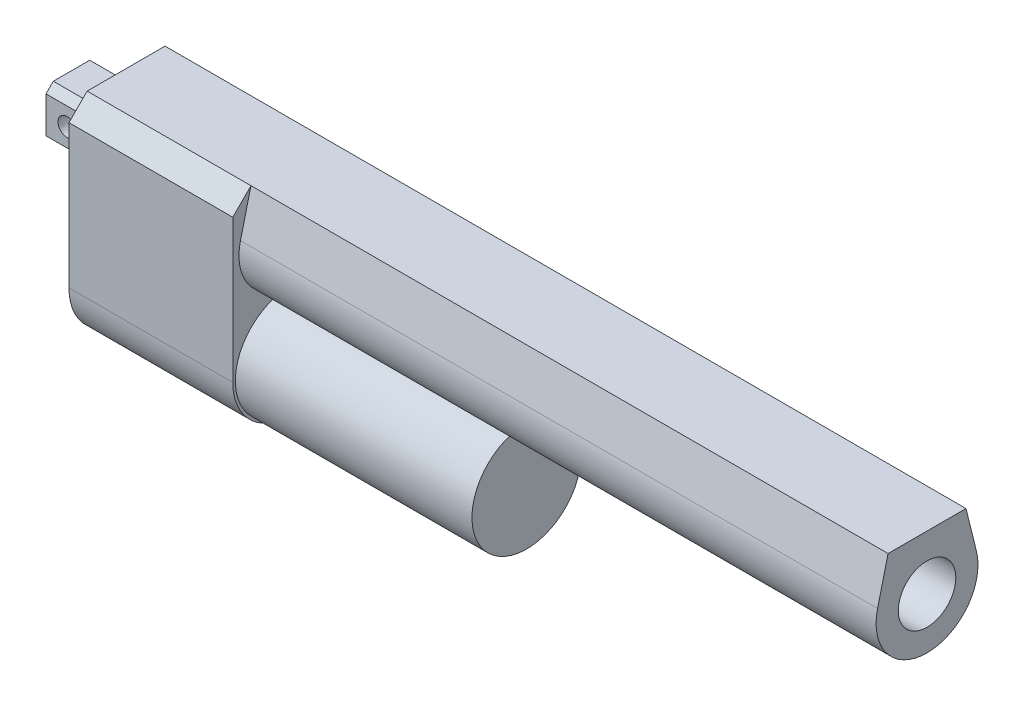
ISO-10303-21;
HEADER;
FILE_DESCRIPTION(('STEP AP214'),'2;1');
FILE_NAME('part.step','',(''),(''),'','','');
FILE_SCHEMA(('AUTOMOTIVE_DESIGN { 1 0 10303 214 1 1 1 1 }'));
ENDSEC;
DATA;
#1=APPLICATION_CONTEXT('core data for automotive mechanical design processes');
#2=APPLICATION_PROTOCOL_DEFINITION('international standard','automotive_design',2000,#1);
#3=PRODUCT_CONTEXT('',#1,'mechanical');
#4=PRODUCT('Part','Part','',(#3));
#5=PRODUCT_RELATED_PRODUCT_CATEGORY('part','',(#4));
#6=PRODUCT_DEFINITION_FORMATION('','',#4);
#7=PRODUCT_DEFINITION_CONTEXT('part definition',#1,'design');
#8=PRODUCT_DEFINITION('design','',#6,#7);
#9=PRODUCT_DEFINITION_SHAPE('','',#8);
#10=(LENGTH_UNIT() NAMED_UNIT(*) SI_UNIT(.MILLI.,.METRE.));
#11=(NAMED_UNIT(*) PLANE_ANGLE_UNIT() SI_UNIT($,.RADIAN.));
#12=(NAMED_UNIT(*) SI_UNIT($,.STERADIAN.) SOLID_ANGLE_UNIT());
#13=UNCERTAINTY_MEASURE_WITH_UNIT(LENGTH_MEASURE(1.E-05),#10,'distance_accuracy_value','');
#14=(GEOMETRIC_REPRESENTATION_CONTEXT(3) GLOBAL_UNCERTAINTY_ASSIGNED_CONTEXT((#13)) GLOBAL_UNIT_ASSIGNED_CONTEXT((#10,
#11,#12)) REPRESENTATION_CONTEXT('',''));
#15=CARTESIAN_POINT('',(0.,0.,0.));
#16=DIRECTION('',(0.,0.,1.));
#17=DIRECTION('',(1.,0.,0.));
#18=AXIS2_PLACEMENT_3D('',#15,#16,#17);
#19=CARTESIAN_POINT('',(57.15,-37.211,0.));
#20=DIRECTION('',(1.,0.,0.));
#21=DIRECTION('',(0.,0.,-1.));
#22=AXIS2_PLACEMENT_3D('',#19,#20,#21);
#23=PLANE('',#22);
#24=CARTESIAN_POINT('',(57.15,-37.211,0.));
#25=DIRECTION('',(1.,0.,0.));
#26=DIRECTION('',(0.,0.,-1.));
#27=AXIS2_PLACEMENT_3D('',#24,#25,#26);
#28=CIRCLE('',#27,19.05);
#29=CARTESIAN_POINT('',(57.15,-37.211,-19.05));
#30=VERTEX_POINT('',#29);
#31=EDGE_CURVE('E248',#30,#30,#28,.T.);
#32=ORIENTED_EDGE('',*,*,#31,.F.);
#33=EDGE_LOOP('',(#32));
#34=FACE_BOUND('',#33,.T.);
#35=CARTESIAN_POINT('',(57.15,0.,0.));
#36=DIRECTION('',(1.,0.,0.));
#37=DIRECTION('',(0.,0.,-1.));
#38=AXIS2_PLACEMENT_3D('',#35,#36,#37);
#39=CIRCLE('',#38,17.78);
#40=CARTESIAN_POINT('',(57.15,4.28552921544395,17.2558001652655));
#41=VERTEX_POINT('',#40);
#42=CARTESIAN_POINT('',(57.15,4.28552921544394,-17.2558001652655));
#43=VERTEX_POINT('',#42);
#44=EDGE_CURVE('E47',#41,#43,#39,.T.);
#45=ORIENTED_EDGE('',*,*,#44,.F.);
#46=DIRECTION('',(0.,-0.970517444615607,0.241030889507533));
#47=VECTOR('',#46,1.);
#48=CARTESIAN_POINT('',(57.15,19.05,13.589));
#49=LINE('',#48,#47);
#50=CARTESIAN_POINT('',(57.15,19.05,13.589));
#51=VERTEX_POINT('',#50);
#52=EDGE_CURVE('E171',#51,#41,#49,.T.);
#53=ORIENTED_EDGE('',*,*,#52,.F.);
#54=DIRECTION('',(0.,-0.707106781186547,0.707106781186547));
#55=VECTOR('',#54,1.);
#56=CARTESIAN_POINT('',(57.15,12.7,19.939));
#57=LINE('',#56,#55);
#58=CARTESIAN_POINT('',(57.15,12.7,19.939));
#59=VERTEX_POINT('',#58);
#60=EDGE_CURVE('E255',#51,#59,#57,.T.);
#61=ORIENTED_EDGE('',*,*,#60,.T.);
#62=DIRECTION('',(0.,-1.,0.));
#63=VECTOR('',#62,1.);
#64=CARTESIAN_POINT('',(57.15,-37.211,19.939));
#65=LINE('',#64,#63);
#66=CARTESIAN_POINT('',(57.15,-37.211,19.939));
#67=VERTEX_POINT('',#66);
#68=EDGE_CURVE('E258',#59,#67,#65,.T.);
#69=ORIENTED_EDGE('',*,*,#68,.T.);
#70=CARTESIAN_POINT('',(57.15,-37.211,0.));
#71=DIRECTION('',(1.,0.,0.));
#72=DIRECTION('',(0.,0.,-1.));
#73=AXIS2_PLACEMENT_3D('',#70,#71,#72);
#74=CIRCLE('',#73,19.939);
#75=CARTESIAN_POINT('',(57.15,-37.211,-19.939));
#76=VERTEX_POINT('',#75);
#77=EDGE_CURVE('E261',#67,#76,#74,.T.);
#78=ORIENTED_EDGE('',*,*,#77,.T.);
#79=DIRECTION('',(0.,1.,0.));
#80=VECTOR('',#79,1.);
#81=CARTESIAN_POINT('',(57.15,-37.211,-19.939));
#82=LINE('',#81,#80);
#83=CARTESIAN_POINT('',(57.15,12.7,-19.939));
#84=VERTEX_POINT('',#83);
#85=EDGE_CURVE('E263',#76,#84,#82,.T.);
#86=ORIENTED_EDGE('',*,*,#85,.T.);
#87=DIRECTION('',(0.,0.707106781186548,0.707106781186547));
#88=VECTOR('',#87,1.);
#89=CARTESIAN_POINT('',(57.15,12.7,-19.939));
#90=LINE('',#89,#88);
#91=CARTESIAN_POINT('',(57.15,19.05,-13.589));
#92=VERTEX_POINT('',#91);
#93=EDGE_CURVE('E265',#84,#92,#90,.T.);
#94=ORIENTED_EDGE('',*,*,#93,.T.);
#95=DIRECTION('',(0.,0.970517444615607,0.241030889507533));
#96=VECTOR('',#95,1.);
#97=CARTESIAN_POINT('',(57.15,19.05,-13.589));
#98=LINE('',#97,#96);
#99=EDGE_CURVE('E52',#43,#92,#98,.T.);
#100=ORIENTED_EDGE('',*,*,#99,.F.);
#101=EDGE_LOOP('',(#45,#53,#61,#69,#78,#86,#94,#100));
#102=FACE_BOUND('',#101,.T.);
#103=ADVANCED_FACE('F32',(#34,#102),#23,.T.);
#104=CARTESIAN_POINT('',(0.,-37.211,0.));
#105=DIRECTION('',(1.,0.,0.));
#106=DIRECTION('',(0.,0.,-1.));
#107=AXIS2_PLACEMENT_3D('',#104,#105,#106);
#108=PLANE('',#107);
#109=DIRECTION('',(0.,-0.707106781186547,0.707106781186547));
#110=VECTOR('',#109,1.);
#111=CARTESIAN_POINT('',(0.,12.7,19.939));
#112=LINE('',#111,#110);
#113=CARTESIAN_POINT('',(0.,19.05,13.589));
#114=VERTEX_POINT('',#113);
#115=CARTESIAN_POINT('',(0.,12.7,19.939));
#116=VERTEX_POINT('',#115);
#117=EDGE_CURVE('E252',#114,#116,#112,.T.);
#118=ORIENTED_EDGE('',*,*,#117,.F.);
#119=DIRECTION('',(0.,0.,1.));
#120=VECTOR('',#119,1.);
#121=CARTESIAN_POINT('',(0.,19.05,13.589));
#122=LINE('',#121,#120);
#123=CARTESIAN_POINT('',(0.,19.05,-13.589));
#124=VERTEX_POINT('',#123);
#125=EDGE_CURVE('E259',#124,#114,#122,.T.);
#126=ORIENTED_EDGE('',*,*,#125,.F.);
#127=DIRECTION('',(0.,0.707106781186548,0.707106781186547));
#128=VECTOR('',#127,1.);
#129=CARTESIAN_POINT('',(0.,12.7,-19.939));
#130=LINE('',#129,#128);
#131=CARTESIAN_POINT('',(0.,12.7,-19.939));
#132=VERTEX_POINT('',#131);
#133=EDGE_CURVE('E276',#132,#124,#130,.T.);
#134=ORIENTED_EDGE('',*,*,#133,.F.);
#135=DIRECTION('',(0.,1.,0.));
#136=VECTOR('',#135,1.);
#137=CARTESIAN_POINT('',(0.,-37.211,-19.939));
#138=LINE('',#137,#136);
#139=CARTESIAN_POINT('',(0.,-37.211,-19.939));
#140=VERTEX_POINT('',#139);
#141=EDGE_CURVE('E274',#140,#132,#138,.T.);
#142=ORIENTED_EDGE('',*,*,#141,.F.);
#143=CARTESIAN_POINT('',(0.,-37.211,0.));
#144=DIRECTION('',(1.,0.,0.));
#145=DIRECTION('',(0.,0.,-1.));
#146=AXIS2_PLACEMENT_3D('',#143,#144,#145);
#147=CIRCLE('',#146,19.939);
#148=CARTESIAN_POINT('',(0.,-37.211,19.939));
#149=VERTEX_POINT('',#148);
#150=EDGE_CURVE('E272',#149,#140,#147,.T.);
#151=ORIENTED_EDGE('',*,*,#150,.F.);
#152=DIRECTION('',(0.,-1.,0.));
#153=VECTOR('',#152,1.);
#154=CARTESIAN_POINT('',(0.,-37.211,19.939));
#155=LINE('',#154,#153);
#156=EDGE_CURVE('E270',#116,#149,#155,.T.);
#157=ORIENTED_EDGE('',*,*,#156,.F.);
#158=EDGE_LOOP('',(#118,#126,#134,#142,#151,#157));
#159=FACE_BOUND('',#158,.T.);
#160=DIRECTION('',(0.,-0.707106781186547,-0.707106781186548));
#161=VECTOR('',#160,1.);
#162=CARTESIAN_POINT('',(0.,6.35,-8.89));
#163=LINE('',#162,#161);
#164=CARTESIAN_POINT('',(0.,8.89,-6.35));
#165=VERTEX_POINT('',#164);
#166=CARTESIAN_POINT('',(0.,6.34999999999999,-8.89));
#167=VERTEX_POINT('',#166);
#168=EDGE_CURVE('E183',#165,#167,#163,.T.);
#169=ORIENTED_EDGE('',*,*,#168,.F.);
#170=DIRECTION('',(0.,0.,-1.));
#171=VECTOR('',#170,1.);
#172=CARTESIAN_POINT('',(0.,8.89,-6.35));
#173=LINE('',#172,#171);
#174=CARTESIAN_POINT('',(0.,8.89,6.35));
#175=VERTEX_POINT('',#174);
#176=EDGE_CURVE('E188',#175,#165,#173,.T.);
#177=ORIENTED_EDGE('',*,*,#176,.F.);
#178=DIRECTION('',(0.,0.707106781186548,-0.707106781186547));
#179=VECTOR('',#178,1.);
#180=CARTESIAN_POINT('',(0.,8.89,6.35));
#181=LINE('',#180,#179);
#182=CARTESIAN_POINT('',(0.,6.35,8.89));
#183=VERTEX_POINT('',#182);
#184=EDGE_CURVE('E220',#183,#175,#181,.T.);
#185=ORIENTED_EDGE('',*,*,#184,.F.);
#186=DIRECTION('',(0.,1.,0.));
#187=VECTOR('',#186,1.);
#188=CARTESIAN_POINT('',(0.,6.35,8.89));
#189=LINE('',#188,#187);
#190=CARTESIAN_POINT('',(0.,-6.34999999999999,8.89));
#191=VERTEX_POINT('',#190);
#192=EDGE_CURVE('E217',#191,#183,#189,.T.);
#193=ORIENTED_EDGE('',*,*,#192,.F.);
#194=DIRECTION('',(0.,0.707106781186548,0.707106781186548));
#195=VECTOR('',#194,1.);
#196=CARTESIAN_POINT('',(0.,-6.35,8.89));
#197=LINE('',#196,#195);
#198=CARTESIAN_POINT('',(0.,-8.89,6.34999999999999));
#199=VERTEX_POINT('',#198);
#200=EDGE_CURVE('E214',#199,#191,#197,.T.);
#201=ORIENTED_EDGE('',*,*,#200,.F.);
#202=DIRECTION('',(0.,0.,1.));
#203=VECTOR('',#202,1.);
#204=CARTESIAN_POINT('',(0.,-8.89,6.35));
#205=LINE('',#204,#203);
#206=CARTESIAN_POINT('',(0.,-8.89,-6.35));
#207=VERTEX_POINT('',#206);
#208=EDGE_CURVE('E211',#207,#199,#205,.T.);
#209=ORIENTED_EDGE('',*,*,#208,.F.);
#210=DIRECTION('',(0.,-0.707106781186547,0.707106781186548));
#211=VECTOR('',#210,1.);
#212=CARTESIAN_POINT('',(0.,-8.89,-6.35));
#213=LINE('',#212,#211);
#214=CARTESIAN_POINT('',(0.,-6.35,-8.89));
#215=VERTEX_POINT('',#214);
#216=EDGE_CURVE('E208',#215,#207,#213,.T.);
#217=ORIENTED_EDGE('',*,*,#216,.F.);
#218=DIRECTION('',(0.,-1.,0.));
#219=VECTOR('',#218,1.);
#220=CARTESIAN_POINT('',(0.,-6.35,-8.89));
#221=LINE('',#220,#219);
#222=EDGE_CURVE('E205',#167,#215,#221,.T.);
#223=ORIENTED_EDGE('',*,*,#222,.F.);
#224=EDGE_LOOP('',(#169,#177,#185,#193,#201,#209,#217,#223));
#225=FACE_BOUND('',#224,.T.);
#226=ADVANCED_FACE('F300',(#159,#225),#108,.F.);
#227=CARTESIAN_POINT('',(57.15,12.7,19.939));
#228=DIRECTION('',(0.,-0.707106781186548,-0.707106781186548));
#229=DIRECTION('',(0.,0.707106781186548,-0.707106781186548));
#230=AXIS2_PLACEMENT_3D('',#227,#228,#229);
#231=PLANE('',#230);
#232=ORIENTED_EDGE('',*,*,#117,.T.);
#233=DIRECTION('',(-1.,0.,0.));
#234=VECTOR('',#233,1.);
#235=CARTESIAN_POINT('',(57.15,12.7,19.939));
#236=LINE('',#235,#234);
#237=EDGE_CURVE('E11',#59,#116,#236,.T.);
#238=ORIENTED_EDGE('',*,*,#237,.F.);
#239=ORIENTED_EDGE('',*,*,#60,.F.);
#240=DIRECTION('',(-1.,0.,0.));
#241=VECTOR('',#240,1.);
#242=CARTESIAN_POINT('',(57.15,19.05,13.589));
#243=LINE('',#242,#241);
#244=EDGE_CURVE('E267',#51,#114,#243,.T.);
#245=ORIENTED_EDGE('',*,*,#244,.T.);
#246=EDGE_LOOP('',(#232,#238,#239,#245));
#247=FACE_BOUND('',#246,.T.);
#248=ADVANCED_FACE('F34',(#247),#231,.F.);
#249=CARTESIAN_POINT('',(57.15,-37.211,19.939));
#250=DIRECTION('',(0.,0.,-1.));
#251=DIRECTION('',(-1.,0.,0.));
#252=AXIS2_PLACEMENT_3D('',#249,#250,#251);
#253=PLANE('',#252);
#254=ORIENTED_EDGE('',*,*,#156,.T.);
#255=DIRECTION('',(-1.,0.,0.));
#256=VECTOR('',#255,1.);
#257=CARTESIAN_POINT('',(57.15,-37.211,19.939));
#258=LINE('',#257,#256);
#259=EDGE_CURVE('E40',#67,#149,#258,.T.);
#260=ORIENTED_EDGE('',*,*,#259,.F.);
#261=ORIENTED_EDGE('',*,*,#68,.F.);
#262=ORIENTED_EDGE('',*,*,#237,.T.);
#263=EDGE_LOOP('',(#254,#260,#261,#262));
#264=FACE_BOUND('',#263,.T.);
#265=ADVANCED_FACE('F313',(#264),#253,.F.);
#266=CARTESIAN_POINT('',(57.15,-37.211,0.));
#267=DIRECTION('',(-1.,0.,0.));
#268=DIRECTION('',(0.,0.,1.));
#269=AXIS2_PLACEMENT_3D('',#266,#267,#268);
#270=CYLINDRICAL_SURFACE('',#269,19.939);
#271=ORIENTED_EDGE('',*,*,#150,.T.);
#272=DIRECTION('',(-1.,0.,0.));
#273=VECTOR('',#272,1.);
#274=CARTESIAN_POINT('',(57.15,-37.211,-19.939));
#275=LINE('',#274,#273);
#276=EDGE_CURVE('E287',#76,#140,#275,.T.);
#277=ORIENTED_EDGE('',*,*,#276,.F.);
#278=ORIENTED_EDGE('',*,*,#77,.F.);
#279=ORIENTED_EDGE('',*,*,#259,.T.);
#280=EDGE_LOOP('',(#271,#277,#278,#279));
#281=FACE_BOUND('',#280,.T.);
#282=ADVANCED_FACE('F294',(#281),#270,.T.);
#283=CARTESIAN_POINT('',(57.15,-37.211,-19.939));
#284=DIRECTION('',(0.,0.,1.));
#285=DIRECTION('',(0.,-1.,0.));
#286=AXIS2_PLACEMENT_3D('',#283,#284,#285);
#287=PLANE('',#286);
#288=ORIENTED_EDGE('',*,*,#141,.T.);
#289=DIRECTION('',(-1.,0.,0.));
#290=VECTOR('',#289,1.);
#291=CARTESIAN_POINT('',(57.15,12.7,-19.939));
#292=LINE('',#291,#290);
#293=EDGE_CURVE('E284',#84,#132,#292,.T.);
#294=ORIENTED_EDGE('',*,*,#293,.F.);
#295=ORIENTED_EDGE('',*,*,#85,.F.);
#296=ORIENTED_EDGE('',*,*,#276,.T.);
#297=EDGE_LOOP('',(#288,#294,#295,#296));
#298=FACE_BOUND('',#297,.T.);
#299=ADVANCED_FACE('F306',(#298),#287,.F.);
#300=CARTESIAN_POINT('',(57.15,12.7,-19.939));
#301=DIRECTION('',(0.,-0.707106781186547,0.707106781186548));
#302=DIRECTION('',(0.,-0.707106781186548,-0.707106781186547));
#303=AXIS2_PLACEMENT_3D('',#300,#301,#302);
#304=PLANE('',#303);
#305=ORIENTED_EDGE('',*,*,#133,.T.);
#306=DIRECTION('',(-1.,0.,0.));
#307=VECTOR('',#306,1.);
#308=CARTESIAN_POINT('',(57.15,19.05,-13.589));
#309=LINE('',#308,#307);
#310=EDGE_CURVE('E281',#92,#124,#309,.T.);
#311=ORIENTED_EDGE('',*,*,#310,.F.);
#312=ORIENTED_EDGE('',*,*,#93,.F.);
#313=ORIENTED_EDGE('',*,*,#293,.T.);
#314=EDGE_LOOP('',(#305,#311,#312,#313));
#315=FACE_BOUND('',#314,.T.);
#316=ADVANCED_FACE('F310',(#315),#304,.F.);
#317=CARTESIAN_POINT('',(57.15,19.05,13.589));
#318=DIRECTION('',(0.,-1.,0.));
#319=DIRECTION('',(0.,0.,-1.));
#320=AXIS2_PLACEMENT_3D('',#317,#318,#319);
#321=PLANE('',#320);
#322=ORIENTED_EDGE('',*,*,#125,.T.);
#323=ORIENTED_EDGE('',*,*,#244,.F.);
#324=DIRECTION('',(-1.,0.,0.));
#325=VECTOR('',#324,1.);
#326=CARTESIAN_POINT('',(279.4,19.05,13.589));
#327=LINE('',#326,#325);
#328=CARTESIAN_POINT('',(279.4,19.05,13.589));
#329=VERTEX_POINT('',#328);
#330=EDGE_CURVE('E321',#329,#51,#327,.T.);
#331=ORIENTED_EDGE('',*,*,#330,.F.);
#332=DIRECTION('',(0.,0.,1.));
#333=VECTOR('',#332,1.);
#334=CARTESIAN_POINT('',(279.4,19.05,13.589));
#335=LINE('',#334,#333);
#336=CARTESIAN_POINT('',(279.4,19.05,-13.589));
#337=VERTEX_POINT('',#336);
#338=EDGE_CURVE('E165',#337,#329,#335,.T.);
#339=ORIENTED_EDGE('',*,*,#338,.F.);
#340=DIRECTION('',(-1.,0.,0.));
#341=VECTOR('',#340,1.);
#342=CARTESIAN_POINT('',(279.4,19.05,-13.589));
#343=LINE('',#342,#341);
#344=EDGE_CURVE('E177',#337,#92,#343,.T.);
#345=ORIENTED_EDGE('',*,*,#344,.T.);
#346=ORIENTED_EDGE('',*,*,#310,.T.);
#347=EDGE_LOOP('',(#322,#323,#331,#339,#345,#346));
#348=FACE_BOUND('',#347,.T.);
#349=ADVANCED_FACE('F317',(#348),#321,.F.);
#350=CARTESIAN_POINT('',(139.7,-37.211,0.));
#351=DIRECTION('',(-1.,0.,0.));
#352=DIRECTION('',(0.,0.,1.));
#353=AXIS2_PLACEMENT_3D('',#350,#351,#352);
#354=CYLINDRICAL_SURFACE('',#353,19.05);
#355=CARTESIAN_POINT('',(139.7,-37.211,0.));
#356=DIRECTION('',(1.,0.,0.));
#357=DIRECTION('',(0.,0.,-1.));
#358=AXIS2_PLACEMENT_3D('',#355,#356,#357);
#359=CIRCLE('',#358,19.05);
#360=CARTESIAN_POINT('',(139.7,-37.211,-19.05));
#361=VERTEX_POINT('',#360);
#362=EDGE_CURVE('E249',#361,#361,#359,.T.);
#363=ORIENTED_EDGE('',*,*,#362,.F.);
#364=EDGE_LOOP('',(#363));
#365=FACE_BOUND('',#364,.T.);
#366=ORIENTED_EDGE('',*,*,#31,.T.);
#367=EDGE_LOOP('',(#366));
#368=FACE_BOUND('',#367,.T.);
#369=ADVANCED_FACE('F360',(#365,#368),#354,.T.);
#370=CARTESIAN_POINT('',(139.7,-37.211,0.));
#371=DIRECTION('',(1.,0.,0.));
#372=DIRECTION('',(0.,0.,-1.));
#373=AXIS2_PLACEMENT_3D('',#370,#371,#372);
#374=PLANE('',#373);
#375=ORIENTED_EDGE('',*,*,#362,.T.);
#376=EDGE_LOOP('',(#375));
#377=FACE_BOUND('',#376,.T.);
#378=ADVANCED_FACE('F388',(#377),#374,.T.);
#379=CARTESIAN_POINT('',(-19.05,6.35,-8.89));
#380=DIRECTION('',(0.,-0.707106781186548,0.707106781186547));
#381=DIRECTION('',(0.,-0.707106781186547,-0.707106781186548));
#382=AXIS2_PLACEMENT_3D('',#379,#380,#381);
#383=PLANE('',#382);
#384=ORIENTED_EDGE('',*,*,#168,.T.);
#385=DIRECTION('',(1.,0.,0.));
#386=VECTOR('',#385,1.);
#387=CARTESIAN_POINT('',(-19.05,6.35,-8.89));
#388=LINE('',#387,#386);
#389=CARTESIAN_POINT('',(-19.05,6.35,-8.89));
#390=VERTEX_POINT('',#389);
#391=EDGE_CURVE('E245',#390,#167,#388,.T.);
#392=ORIENTED_EDGE('',*,*,#391,.F.);
#393=DIRECTION('',(0.,-0.707106781186547,-0.707106781186548));
#394=VECTOR('',#393,1.);
#395=CARTESIAN_POINT('',(-19.05,6.35,-8.89));
#396=LINE('',#395,#394);
#397=CARTESIAN_POINT('',(-19.05,8.89,-6.35));
#398=VERTEX_POINT('',#397);
#399=EDGE_CURVE('E184',#398,#390,#396,.T.);
#400=ORIENTED_EDGE('',*,*,#399,.F.);
#401=DIRECTION('',(1.,0.,0.));
#402=VECTOR('',#401,1.);
#403=CARTESIAN_POINT('',(-19.05,8.89,-6.35));
#404=LINE('',#403,#402);
#405=EDGE_CURVE('E202',#398,#165,#404,.T.);
#406=ORIENTED_EDGE('',*,*,#405,.T.);
#407=EDGE_LOOP('',(#384,#392,#400,#406));
#408=FACE_BOUND('',#407,.T.);
#409=ADVANCED_FACE('F392',(#408),#383,.F.);
#410=CARTESIAN_POINT('',(-19.05,-6.35,-8.89));
#411=DIRECTION('',(0.,0.,1.));
#412=DIRECTION('',(1.,0.,0.));
#413=AXIS2_PLACEMENT_3D('',#410,#411,#412);
#414=PLANE('',#413);
#415=CARTESIAN_POINT('',(-11.684,0.,-8.89));
#416=DIRECTION('',(0.,0.,1.));
#417=DIRECTION('',(1.,0.,0.));
#418=AXIS2_PLACEMENT_3D('',#415,#416,#417);
#419=CIRCLE('',#418,3.175);
#420=CARTESIAN_POINT('',(-8.509,0.,-8.89));
#421=VERTEX_POINT('',#420);
#422=EDGE_CURVE('E175',#421,#421,#419,.T.);
#423=ORIENTED_EDGE('',*,*,#422,.T.);
#424=EDGE_LOOP('',(#423));
#425=FACE_BOUND('',#424,.T.);
#426=ORIENTED_EDGE('',*,*,#222,.T.);
#427=DIRECTION('',(1.,0.,0.));
#428=VECTOR('',#427,1.);
#429=CARTESIAN_POINT('',(-19.05,-6.35,-8.89));
#430=LINE('',#429,#428);
#431=CARTESIAN_POINT('',(-19.05,-6.35,-8.89));
#432=VERTEX_POINT('',#431);
#433=EDGE_CURVE('E242',#432,#215,#430,.T.);
#434=ORIENTED_EDGE('',*,*,#433,.F.);
#435=DIRECTION('',(0.,-1.,0.));
#436=VECTOR('',#435,1.);
#437=CARTESIAN_POINT('',(-19.05,-6.35,-8.89));
#438=LINE('',#437,#436);
#439=EDGE_CURVE('E187',#390,#432,#438,.T.);
#440=ORIENTED_EDGE('',*,*,#439,.F.);
#441=ORIENTED_EDGE('',*,*,#391,.T.);
#442=EDGE_LOOP('',(#426,#434,#440,#441));
#443=FACE_BOUND('',#442,.T.);
#444=ADVANCED_FACE('F396',(#425,#443),#414,.F.);
#445=CARTESIAN_POINT('',(-19.05,-8.89,-6.35));
#446=DIRECTION('',(0.,0.707106781186548,0.707106781186547));
#447=DIRECTION('',(0.,-0.707106781186547,0.707106781186548));
#448=AXIS2_PLACEMENT_3D('',#445,#446,#447);
#449=PLANE('',#448);
#450=ORIENTED_EDGE('',*,*,#216,.T.);
#451=DIRECTION('',(1.,0.,0.));
#452=VECTOR('',#451,1.);
#453=CARTESIAN_POINT('',(-19.05,-8.89,-6.35));
#454=LINE('',#453,#452);
#455=CARTESIAN_POINT('',(-19.05,-8.89,-6.35));
#456=VERTEX_POINT('',#455);
#457=EDGE_CURVE('E239',#456,#207,#454,.T.);
#458=ORIENTED_EDGE('',*,*,#457,.F.);
#459=DIRECTION('',(0.,-0.707106781186547,0.707106781186548));
#460=VECTOR('',#459,1.);
#461=CARTESIAN_POINT('',(-19.05,-8.89,-6.35));
#462=LINE('',#461,#460);
#463=EDGE_CURVE('E190',#432,#456,#462,.T.);
#464=ORIENTED_EDGE('',*,*,#463,.F.);
#465=ORIENTED_EDGE('',*,*,#433,.T.);
#466=EDGE_LOOP('',(#450,#458,#464,#465));
#467=FACE_BOUND('',#466,.T.);
#468=ADVANCED_FACE('F404',(#467),#449,.F.);
#469=CARTESIAN_POINT('',(-19.05,-8.89,6.35));
#470=DIRECTION('',(0.,1.,0.));
#471=DIRECTION('',(0.,0.,1.));
#472=AXIS2_PLACEMENT_3D('',#469,#470,#471);
#473=PLANE('',#472);
#474=ORIENTED_EDGE('',*,*,#208,.T.);
#475=DIRECTION('',(1.,0.,0.));
#476=VECTOR('',#475,1.);
#477=CARTESIAN_POINT('',(-19.05,-8.89,6.35));
#478=LINE('',#477,#476);
#479=CARTESIAN_POINT('',(-19.05,-8.89,6.35));
#480=VERTEX_POINT('',#479);
#481=EDGE_CURVE('E236',#480,#199,#478,.T.);
#482=ORIENTED_EDGE('',*,*,#481,.F.);
#483=DIRECTION('',(0.,0.,1.));
#484=VECTOR('',#483,1.);
#485=CARTESIAN_POINT('',(-19.05,-8.89,6.35));
#486=LINE('',#485,#484);
#487=EDGE_CURVE('E192',#456,#480,#486,.T.);
#488=ORIENTED_EDGE('',*,*,#487,.F.);
#489=ORIENTED_EDGE('',*,*,#457,.T.);
#490=EDGE_LOOP('',(#474,#482,#488,#489));
#491=FACE_BOUND('',#490,.T.);
#492=ADVANCED_FACE('F409',(#491),#473,.F.);
#493=CARTESIAN_POINT('',(-19.05,-6.35,8.89));
#494=DIRECTION('',(0.,0.707106781186548,-0.707106781186548));
#495=DIRECTION('',(0.,0.707106781186548,0.707106781186548));
#496=AXIS2_PLACEMENT_3D('',#493,#494,#495);
#497=PLANE('',#496);
#498=ORIENTED_EDGE('',*,*,#200,.T.);
#499=DIRECTION('',(1.,0.,0.));
#500=VECTOR('',#499,1.);
#501=CARTESIAN_POINT('',(-19.05,-6.35,8.89));
#502=LINE('',#501,#500);
#503=CARTESIAN_POINT('',(-19.05,-6.35,8.89));
#504=VERTEX_POINT('',#503);
#505=EDGE_CURVE('E233',#504,#191,#502,.T.);
#506=ORIENTED_EDGE('',*,*,#505,.F.);
#507=DIRECTION('',(0.,0.707106781186548,0.707106781186548));
#508=VECTOR('',#507,1.);
#509=CARTESIAN_POINT('',(-19.05,-6.35,8.89));
#510=LINE('',#509,#508);
#511=EDGE_CURVE('E194',#480,#504,#510,.T.);
#512=ORIENTED_EDGE('',*,*,#511,.F.);
#513=ORIENTED_EDGE('',*,*,#481,.T.);
#514=EDGE_LOOP('',(#498,#506,#512,#513));
#515=FACE_BOUND('',#514,.T.);
#516=ADVANCED_FACE('F419',(#515),#497,.F.);
#517=CARTESIAN_POINT('',(-19.05,6.35,8.89));
#518=DIRECTION('',(0.,0.,-1.));
#519=DIRECTION('',(-1.,0.,0.));
#520=AXIS2_PLACEMENT_3D('',#517,#518,#519);
#521=PLANE('',#520);
#522=CARTESIAN_POINT('',(-11.684,0.,8.89));
#523=DIRECTION('',(0.,0.,1.));
#524=DIRECTION('',(1.,0.,0.));
#525=AXIS2_PLACEMENT_3D('',#522,#523,#524);
#526=CIRCLE('',#525,3.175);
#527=CARTESIAN_POINT('',(-8.509,0.,8.89));
#528=VERTEX_POINT('',#527);
#529=EDGE_CURVE('E172',#528,#528,#526,.T.);
#530=ORIENTED_EDGE('',*,*,#529,.F.);
#531=EDGE_LOOP('',(#530));
#532=FACE_BOUND('',#531,.T.);
#533=ORIENTED_EDGE('',*,*,#192,.T.);
#534=DIRECTION('',(1.,0.,0.));
#535=VECTOR('',#534,1.);
#536=CARTESIAN_POINT('',(-19.05,6.35,8.89));
#537=LINE('',#536,#535);
#538=CARTESIAN_POINT('',(-19.05,6.35,8.89));
#539=VERTEX_POINT('',#538);
#540=EDGE_CURVE('E230',#539,#183,#537,.T.);
#541=ORIENTED_EDGE('',*,*,#540,.F.);
#542=DIRECTION('',(0.,1.,0.));
#543=VECTOR('',#542,1.);
#544=CARTESIAN_POINT('',(-19.05,6.35,8.89));
#545=LINE('',#544,#543);
#546=EDGE_CURVE('E196',#504,#539,#545,.T.);
#547=ORIENTED_EDGE('',*,*,#546,.F.);
#548=ORIENTED_EDGE('',*,*,#505,.T.);
#549=EDGE_LOOP('',(#533,#541,#547,#548));
#550=FACE_BOUND('',#549,.T.);
#551=ADVANCED_FACE('F429',(#532,#550),#521,.F.);
#552=CARTESIAN_POINT('',(-19.05,8.89,6.35));
#553=DIRECTION('',(0.,-0.707106781186547,-0.707106781186548));
#554=DIRECTION('',(0.,0.707106781186548,-0.707106781186547));
#555=AXIS2_PLACEMENT_3D('',#552,#553,#554);
#556=PLANE('',#555);
#557=ORIENTED_EDGE('',*,*,#184,.T.);
#558=DIRECTION('',(1.,0.,0.));
#559=VECTOR('',#558,1.);
#560=CARTESIAN_POINT('',(-19.05,8.89,6.35));
#561=LINE('',#560,#559);
#562=CARTESIAN_POINT('',(-19.05,8.89,6.35));
#563=VERTEX_POINT('',#562);
#564=EDGE_CURVE('E227',#563,#175,#561,.T.);
#565=ORIENTED_EDGE('',*,*,#564,.F.);
#566=DIRECTION('',(0.,0.707106781186548,-0.707106781186547));
#567=VECTOR('',#566,1.);
#568=CARTESIAN_POINT('',(-19.05,8.89,6.35));
#569=LINE('',#568,#567);
#570=EDGE_CURVE('E198',#539,#563,#569,.T.);
#571=ORIENTED_EDGE('',*,*,#570,.F.);
#572=ORIENTED_EDGE('',*,*,#540,.T.);
#573=EDGE_LOOP('',(#557,#565,#571,#572));
#574=FACE_BOUND('',#573,.T.);
#575=ADVANCED_FACE('F437',(#574),#556,.F.);
#576=CARTESIAN_POINT('',(-19.05,8.89,-6.35));
#577=DIRECTION('',(0.,-1.,0.));
#578=DIRECTION('',(0.,0.,-1.));
#579=AXIS2_PLACEMENT_3D('',#576,#577,#578);
#580=PLANE('',#579);
#581=ORIENTED_EDGE('',*,*,#176,.T.);
#582=ORIENTED_EDGE('',*,*,#405,.F.);
#583=DIRECTION('',(0.,0.,-1.));
#584=VECTOR('',#583,1.);
#585=CARTESIAN_POINT('',(-19.05,8.89,-6.35));
#586=LINE('',#585,#584);
#587=EDGE_CURVE('E200',#563,#398,#586,.T.);
#588=ORIENTED_EDGE('',*,*,#587,.F.);
#589=ORIENTED_EDGE('',*,*,#564,.T.);
#590=EDGE_LOOP('',(#581,#582,#588,#589));
#591=FACE_BOUND('',#590,.T.);
#592=ADVANCED_FACE('F442',(#591),#580,.F.);
#593=CARTESIAN_POINT('',(-19.05,0.,0.));
#594=DIRECTION('',(1.,0.,0.));
#595=DIRECTION('',(0.,0.,-1.));
#596=AXIS2_PLACEMENT_3D('',#593,#594,#595);
#597=PLANE('',#596);
#598=ORIENTED_EDGE('',*,*,#399,.T.);
#599=ORIENTED_EDGE('',*,*,#439,.T.);
#600=ORIENTED_EDGE('',*,*,#463,.T.);
#601=ORIENTED_EDGE('',*,*,#487,.T.);
#602=ORIENTED_EDGE('',*,*,#511,.T.);
#603=ORIENTED_EDGE('',*,*,#546,.T.);
#604=ORIENTED_EDGE('',*,*,#570,.T.);
#605=ORIENTED_EDGE('',*,*,#587,.T.);
#606=EDGE_LOOP('',(#598,#599,#600,#601,#602,#603,#604,#605));
#607=FACE_BOUND('',#606,.T.);
#608=ADVANCED_FACE('F452',(#607),#597,.F.);
#609=CARTESIAN_POINT('',(-11.684,0.,-19.939));
#610=DIRECTION('',(0.,0.,1.));
#611=DIRECTION('',(1.,0.,0.));
#612=AXIS2_PLACEMENT_3D('',#609,#610,#611);
#613=CYLINDRICAL_SURFACE('',#612,3.175);
#614=ORIENTED_EDGE('',*,*,#529,.T.);
#615=EDGE_LOOP('',(#614));
#616=FACE_BOUND('',#615,.T.);
#617=ORIENTED_EDGE('',*,*,#422,.F.);
#618=EDGE_LOOP('',(#617));
#619=FACE_BOUND('',#618,.T.);
#620=ADVANCED_FACE('F462',(#616,#619),#613,.F.);
#621=CARTESIAN_POINT('',(279.4,19.05,13.589));
#622=DIRECTION('',(0.,-0.241030889507533,-0.970517444615607));
#623=DIRECTION('',(0.,0.970517444615607,-0.241030889507533));
#624=AXIS2_PLACEMENT_3D('',#621,#622,#623);
#625=PLANE('',#624);
#626=ORIENTED_EDGE('',*,*,#52,.T.);
#627=DIRECTION('',(-1.,0.,0.));
#628=VECTOR('',#627,1.);
#629=CARTESIAN_POINT('',(279.4,4.28552921544395,17.2558001652655));
#630=LINE('',#629,#628);
#631=CARTESIAN_POINT('',(279.4,4.28552921544395,17.2558001652655));
#632=VERTEX_POINT('',#631);
#633=EDGE_CURVE('E153',#632,#41,#630,.T.);
#634=ORIENTED_EDGE('',*,*,#633,.F.);
#635=DIRECTION('',(0.,-0.970517444615607,0.241030889507533));
#636=VECTOR('',#635,1.);
#637=CARTESIAN_POINT('',(279.4,19.05,13.589));
#638=LINE('',#637,#636);
#639=EDGE_CURVE('E160',#329,#632,#638,.T.);
#640=ORIENTED_EDGE('',*,*,#639,.F.);
#641=ORIENTED_EDGE('',*,*,#330,.T.);
#642=EDGE_LOOP('',(#626,#634,#640,#641));
#643=FACE_BOUND('',#642,.T.);
#644=ADVANCED_FACE('F170',(#643),#625,.F.);
#645=CARTESIAN_POINT('',(279.4,0.,0.));
#646=DIRECTION('',(-1.,0.,0.));
#647=DIRECTION('',(0.,0.,1.));
#648=AXIS2_PLACEMENT_3D('',#645,#646,#647);
#649=CYLINDRICAL_SURFACE('',#648,17.78);
#650=ORIENTED_EDGE('',*,*,#44,.T.);
#651=DIRECTION('',(-1.,0.,0.));
#652=VECTOR('',#651,1.);
#653=CARTESIAN_POINT('',(279.4,4.28552921544394,-17.2558001652655));
#654=LINE('',#653,#652);
#655=CARTESIAN_POINT('',(279.4,4.28552921544394,-17.2558001652655));
#656=VERTEX_POINT('',#655);
#657=EDGE_CURVE('E156',#656,#43,#654,.T.);
#658=ORIENTED_EDGE('',*,*,#657,.F.);
#659=CARTESIAN_POINT('',(279.4,0.,0.));
#660=DIRECTION('',(1.,0.,0.));
#661=DIRECTION('',(0.,0.,-1.));
#662=AXIS2_PLACEMENT_3D('',#659,#660,#661);
#663=CIRCLE('',#662,17.78);
#664=EDGE_CURVE('E149',#632,#656,#663,.T.);
#665=ORIENTED_EDGE('',*,*,#664,.F.);
#666=ORIENTED_EDGE('',*,*,#633,.T.);
#667=EDGE_LOOP('',(#650,#658,#665,#666));
#668=FACE_BOUND('',#667,.T.);
#669=ADVANCED_FACE('F151',(#668),#649,.T.);
#670=CARTESIAN_POINT('',(279.4,19.05,-13.589));
#671=DIRECTION('',(0.,-0.241030889507533,0.970517444615607));
#672=DIRECTION('',(0.,-0.970517444615607,-0.241030889507533));
#673=AXIS2_PLACEMENT_3D('',#670,#671,#672);
#674=PLANE('',#673);
#675=ORIENTED_EDGE('',*,*,#99,.T.);
#676=ORIENTED_EDGE('',*,*,#344,.F.);
#677=DIRECTION('',(0.,0.970517444615607,0.241030889507533));
#678=VECTOR('',#677,1.);
#679=CARTESIAN_POINT('',(279.4,19.05,-13.589));
#680=LINE('',#679,#678);
#681=EDGE_CURVE('E159',#656,#337,#680,.T.);
#682=ORIENTED_EDGE('',*,*,#681,.F.);
#683=ORIENTED_EDGE('',*,*,#657,.T.);
#684=EDGE_LOOP('',(#675,#676,#682,#683));
#685=FACE_BOUND('',#684,.T.);
#686=ADVANCED_FACE('F345',(#685),#674,.F.);
#687=CARTESIAN_POINT('',(279.4,0.,0.));
#688=DIRECTION('',(1.,0.,0.));
#689=DIRECTION('',(0.,0.,-1.));
#690=AXIS2_PLACEMENT_3D('',#687,#688,#689);
#691=PLANE('',#690);
#692=CARTESIAN_POINT('',(279.4,0.,0.));
#693=DIRECTION('',(1.,0.,0.));
#694=DIRECTION('',(0.,0.,-1.));
#695=AXIS2_PLACEMENT_3D('',#692,#693,#694);
#696=CIRCLE('',#695,10.033);
#697=CARTESIAN_POINT('',(279.4,0.,-10.033));
#698=VERTEX_POINT('',#697);
#699=EDGE_CURVE('E330',#698,#698,#696,.T.);
#700=ORIENTED_EDGE('',*,*,#699,.F.);
#701=EDGE_LOOP('',(#700));
#702=FACE_BOUND('',#701,.T.);
#703=ORIENTED_EDGE('',*,*,#639,.T.);
#704=ORIENTED_EDGE('',*,*,#664,.T.);
#705=ORIENTED_EDGE('',*,*,#681,.T.);
#706=ORIENTED_EDGE('',*,*,#338,.T.);
#707=EDGE_LOOP('',(#703,#704,#705,#706));
#708=FACE_BOUND('',#707,.T.);
#709=ADVANCED_FACE('F163',(#702,#708),#691,.T.);
#710=CARTESIAN_POINT('',(76.2,0.,0.));
#711=DIRECTION('',(1.,0.,0.));
#712=DIRECTION('',(0.,0.,-1.));
#713=AXIS2_PLACEMENT_3D('',#710,#711,#712);
#714=CYLINDRICAL_SURFACE('',#713,10.033);
#715=CARTESIAN_POINT('',(76.2,0.,0.));
#716=DIRECTION('',(1.,0.,0.));
#717=DIRECTION('',(0.,0.,-1.));
#718=AXIS2_PLACEMENT_3D('',#715,#716,#717);
#719=CIRCLE('',#718,10.033);
#720=CARTESIAN_POINT('',(76.2,0.,-10.033));
#721=VERTEX_POINT('',#720);
#722=EDGE_CURVE('E327',#721,#721,#719,.T.);
#723=ORIENTED_EDGE('',*,*,#722,.F.);
#724=EDGE_LOOP('',(#723));
#725=FACE_BOUND('',#724,.T.);
#726=ORIENTED_EDGE('',*,*,#699,.T.);
#727=EDGE_LOOP('',(#726));
#728=FACE_BOUND('',#727,.T.);
#729=ADVANCED_FACE('F338',(#725,#728),#714,.F.);
#730=CARTESIAN_POINT('',(76.2,0.,0.));
#731=DIRECTION('',(1.,0.,0.));
#732=DIRECTION('',(0.,0.,-1.));
#733=AXIS2_PLACEMENT_3D('',#730,#731,#732);
#734=PLANE('',#733);
#735=ORIENTED_EDGE('',*,*,#722,.T.);
#736=EDGE_LOOP('',(#735));
#737=FACE_BOUND('',#736,.T.);
#738=ADVANCED_FACE('F336',(#737),#734,.T.);
#739=CLOSED_SHELL('',(#103,#226,#248,#265,#282,#299,#316,#349,#369,#378,#409,#444,#468,#492,
#516,#551,#575,#592,#608,#620,#644,#669,#686,#709,#729,#738));
#740=MANIFOLD_SOLID_BREP('B2',#739);
#741=ADVANCED_BREP_SHAPE_REPRESENTATION('',(#18,#740),#14);
#742=SHAPE_DEFINITION_REPRESENTATION(#9,#741);
ENDSEC;
END-ISO-10303-21;
